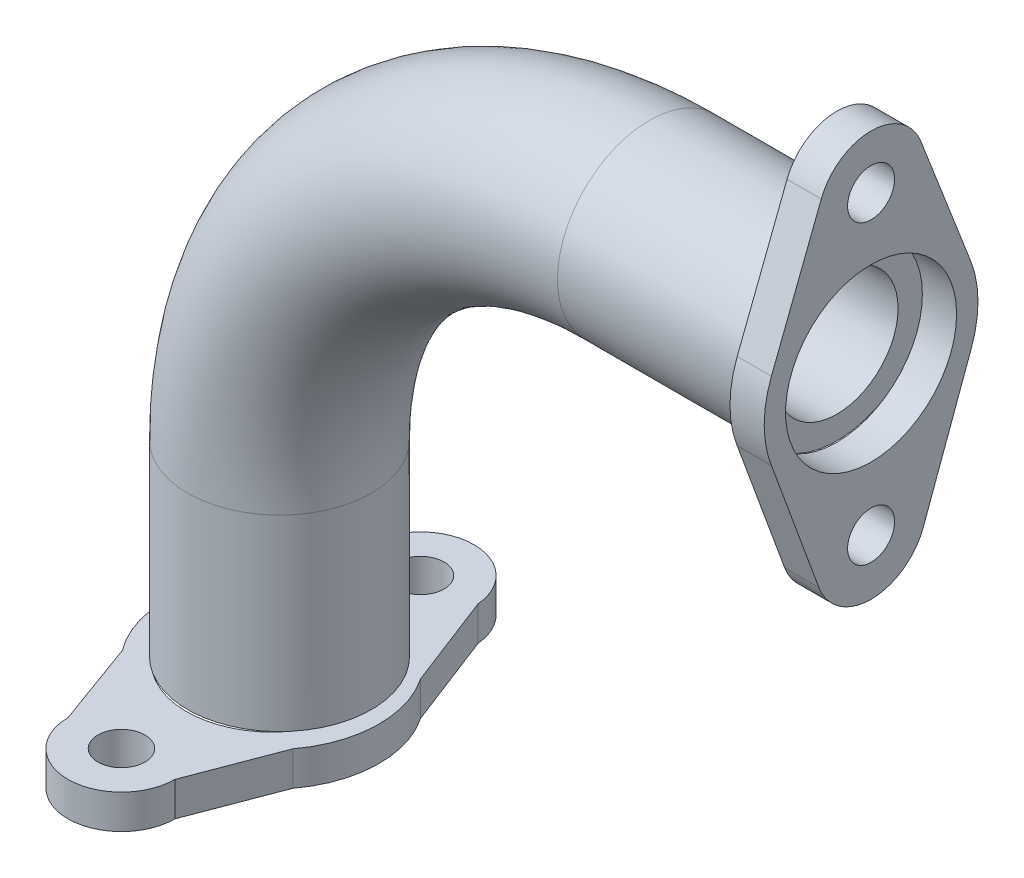
ISO-10303-21;
HEADER;
FILE_DESCRIPTION(('STEP AP214'),'2;1');
FILE_NAME('part.step','',(''),(''),'','','');
FILE_SCHEMA(('AUTOMOTIVE_DESIGN { 1 0 10303 214 1 1 1 1 }'));
ENDSEC;
DATA;
#1=APPLICATION_CONTEXT('core data for automotive mechanical design processes');
#2=APPLICATION_PROTOCOL_DEFINITION('international standard','automotive_design',2000,#1);
#3=PRODUCT_CONTEXT('',#1,'mechanical');
#4=PRODUCT('Part','Part','',(#3));
#5=PRODUCT_RELATED_PRODUCT_CATEGORY('part','',(#4));
#6=PRODUCT_DEFINITION_FORMATION('','',#4);
#7=PRODUCT_DEFINITION_CONTEXT('part definition',#1,'design');
#8=PRODUCT_DEFINITION('design','',#6,#7);
#9=PRODUCT_DEFINITION_SHAPE('','',#8);
#10=(LENGTH_UNIT() NAMED_UNIT(*) SI_UNIT(.MILLI.,.METRE.));
#11=(NAMED_UNIT(*) PLANE_ANGLE_UNIT() SI_UNIT($,.RADIAN.));
#12=(NAMED_UNIT(*) SI_UNIT($,.STERADIAN.) SOLID_ANGLE_UNIT());
#13=UNCERTAINTY_MEASURE_WITH_UNIT(LENGTH_MEASURE(1.E-05),#10,'distance_accuracy_value','');
#14=(GEOMETRIC_REPRESENTATION_CONTEXT(3) GLOBAL_UNCERTAINTY_ASSIGNED_CONTEXT((#13)) GLOBAL_UNIT_ASSIGNED_CONTEXT((#10,
#11,#12)) REPRESENTATION_CONTEXT('',''));
#15=CARTESIAN_POINT('',(0.,0.,0.));
#16=DIRECTION('',(0.,0.,1.));
#17=DIRECTION('',(1.,0.,0.));
#18=AXIS2_PLACEMENT_3D('',#15,#16,#17);
#19=CARTESIAN_POINT('',(-15.1734272968654,84.3401404687311,0.));
#20=DIRECTION('',(-1.,0.,0.));
#21=DIRECTION('',(0.,0.,1.));
#22=AXIS2_PLACEMENT_3D('',#19,#20,#21);
#23=CYLINDRICAL_SURFACE('',#22,21.5);
#24=CARTESIAN_POINT('',(-59.008690724229,84.3401404687311,0.));
#25=DIRECTION('',(-1.,0.,0.));
#26=DIRECTION('',(0.,0.,1.));
#27=AXIS2_PLACEMENT_3D('',#24,#25,#26);
#28=CIRCLE('',#27,21.5);
#29=CARTESIAN_POINT('',(-59.008690724229,105.840140468731,0.));
#30=VERTEX_POINT('',#29);
#31=EDGE_CURVE('E312',#30,#30,#28,.T.);
#32=ORIENTED_EDGE('',*,*,#31,.F.);
#33=EDGE_LOOP('',(#32));
#34=FACE_BOUND('',#33,.T.);
#35=CARTESIAN_POINT('',(-15.1734272968654,84.3401404687311,0.));
#36=DIRECTION('',(-1.,0.,0.));
#37=DIRECTION('',(0.,0.,1.));
#38=AXIS2_PLACEMENT_3D('',#35,#36,#37);
#39=CIRCLE('',#38,21.5);
#40=CARTESIAN_POINT('',(-15.1734272968654,66.0012416291643,-11.2220670712723));
#41=VERTEX_POINT('',#40);
#42=CARTESIAN_POINT('',(-15.1734272968654,66.0012416291643,11.2220670712723));
#43=VERTEX_POINT('',#42);
#44=EDGE_CURVE('E309',#41,#43,#39,.T.);
#45=ORIENTED_EDGE('',*,*,#44,.T.);
#46=EDGE_CURVE('E308',#43,#41,#39,.T.);
#47=ORIENTED_EDGE('',*,*,#46,.T.);
#48=EDGE_LOOP('',(#45,#47));
#49=FACE_BOUND('',#48,.T.);
#50=ADVANCED_FACE('F49',(#34,#49),#23,.T.);
#51=CARTESIAN_POINT('',(-59.008690724229,-2.15985953126885,0.));
#52=DIRECTION('',(0.,0.,1.));
#53=DIRECTION('',(1.,0.,0.));
#54=AXIS2_PLACEMENT_3D('',#51,#52,#53);
#55=TOROIDAL_SURFACE('',#54,86.5,21.5);
#56=CARTESIAN_POINT('',(-145.508690724229,-2.15985953126884,0.));
#57=DIRECTION('',(0.,-1.,0.));
#58=DIRECTION('',(0.,0.,1.));
#59=AXIS2_PLACEMENT_3D('',#56,#57,#58);
#60=CIRCLE('',#59,21.5);
#61=CARTESIAN_POINT('',(-167.008690724229,-2.15985953126884,0.));
#62=VERTEX_POINT('',#61);
#63=EDGE_CURVE('E187',#62,#62,#60,.T.);
#64=CARTESIAN_POINT('',(-59.008690724229,-2.15985953126885,0.));
#65=DIRECTION('',(0.,0.,1.));
#66=DIRECTION('',(1.,0.,0.));
#67=AXIS2_PLACEMENT_3D('',#64,#65,#66);
#68=CIRCLE('',#67,108.);
#69=EDGE_CURVE('',#30,#62,#68,.T.);
#70=ORIENTED_EDGE('',*,*,#31,.T.);
#71=ORIENTED_EDGE('',*,*,#63,.F.);
#72=ORIENTED_EDGE('',*,*,#69,.T.);
#73=ORIENTED_EDGE('',*,*,#69,.F.);
#74=EDGE_LOOP('',(#70,#72,#71,#73));
#75=FACE_BOUND('',#74,.T.);
#76=ADVANCED_FACE('F405',(#75),#55,.T.);
#77=CARTESIAN_POINT('',(-145.508690724229,-2.15985953126883,0.));
#78=DIRECTION('',(0.,-1.,0.));
#79=DIRECTION('',(0.,0.,-1.));
#80=AXIS2_PLACEMENT_3D('',#77,#78,#79);
#81=CYLINDRICAL_SURFACE('',#80,21.5);
#82=CARTESIAN_POINT('',(-145.508690724229,-45.9951229586325,0.));
#83=DIRECTION('',(0.,-1.,0.));
#84=DIRECTION('',(0.,0.,1.));
#85=AXIS2_PLACEMENT_3D('',#82,#83,#84);
#86=CIRCLE('',#85,21.5);
#87=CARTESIAN_POINT('',(-156.979061247246,-45.9951229586325,18.1846253759792));
#88=VERTEX_POINT('',#87);
#89=CARTESIAN_POINT('',(-129.063546314704,-45.9951229586325,13.8494485576091));
#90=VERTEX_POINT('',#89);
#91=EDGE_CURVE('E12',#88,#90,#86,.T.);
#92=ORIENTED_EDGE('',*,*,#91,.F.);
#93=EDGE_CURVE('E58',#90,#88,#86,.T.);
#94=ORIENTED_EDGE('',*,*,#93,.F.);
#95=EDGE_LOOP('',(#92,#94));
#96=FACE_BOUND('',#95,.T.);
#97=ORIENTED_EDGE('',*,*,#63,.T.);
#98=EDGE_LOOP('',(#97));
#99=FACE_BOUND('',#98,.T.);
#100=ADVANCED_FACE('F51',(#96,#99),#81,.T.);
#101=CARTESIAN_POINT('',(-7.17342729686537,117.127377221303,0.));
#102=DIRECTION('',(-1.,0.,0.));
#103=DIRECTION('',(0.,0.,1.));
#104=AXIS2_PLACEMENT_3D('',#101,#102,#103);
#105=CYLINDRICAL_SURFACE('',#104,12.5);
#106=CARTESIAN_POINT('',(-15.1734272968654,117.127377221303,0.));
#107=DIRECTION('',(1.,0.,0.));
#108=DIRECTION('',(0.,0.,-1.));
#109=AXIS2_PLACEMENT_3D('',#106,#107,#108);
#110=CIRCLE('',#109,12.5);
#111=CARTESIAN_POINT('',(-15.1734272968654,121.647035289315,-11.6542992474131));
#112=VERTEX_POINT('',#111);
#113=CARTESIAN_POINT('',(-15.1734272968654,121.647035289315,11.6542992474131));
#114=VERTEX_POINT('',#113);
#115=EDGE_CURVE('E250',#112,#114,#110,.T.);
#116=ORIENTED_EDGE('',*,*,#115,.T.);
#117=DIRECTION('',(-1.,0.,0.));
#118=VECTOR('',#117,1.);
#119=CARTESIAN_POINT('',(-7.17342729686537,121.647035289315,11.6542992474131));
#120=LINE('',#119,#118);
#121=CARTESIAN_POINT('',(-7.17342729686537,121.647035289315,11.6542992474131));
#122=VERTEX_POINT('',#121);
#123=EDGE_CURVE('E305',#122,#114,#120,.T.);
#124=ORIENTED_EDGE('',*,*,#123,.F.);
#125=CARTESIAN_POINT('',(-7.17342729686537,117.127377221303,0.));
#126=DIRECTION('',(1.,0.,0.));
#127=DIRECTION('',(0.,0.,-1.));
#128=AXIS2_PLACEMENT_3D('',#125,#126,#127);
#129=CIRCLE('',#128,12.5);
#130=CARTESIAN_POINT('',(-7.17342729686537,121.647035289315,-11.6542992474131));
#131=VERTEX_POINT('',#130);
#132=EDGE_CURVE('E251',#131,#122,#129,.T.);
#133=ORIENTED_EDGE('',*,*,#132,.F.);
#134=DIRECTION('',(-1.,0.,0.));
#135=VECTOR('',#134,1.);
#136=CARTESIAN_POINT('',(-7.17342729686537,121.647035289315,-11.6542992474131));
#137=LINE('',#136,#135);
#138=EDGE_CURVE('E269',#131,#112,#137,.T.);
#139=ORIENTED_EDGE('',*,*,#138,.T.);
#140=EDGE_LOOP('',(#116,#124,#133,#139));
#141=FACE_BOUND('',#140,.T.);
#142=ADVANCED_FACE('F404',(#141),#105,.T.);
#143=CARTESIAN_POINT('',(-7.17342729686537,121.647035289315,11.6542992474131));
#144=DIRECTION('',(0.,-0.361572645440974,-0.932343939793044));
#145=DIRECTION('',(0.,0.932343939793044,-0.361572645440974));
#146=AXIS2_PLACEMENT_3D('',#143,#144,#145);
#147=PLANE('',#146);
#148=DIRECTION('',(0.,-0.932343939793044,0.361572645440974));
#149=VECTOR('',#148,1.);
#150=CARTESIAN_POINT('',(-15.1734272968654,121.647035289315,11.6542992474131));
#151=LINE('',#150,#149);
#152=CARTESIAN_POINT('',(-15.1734272968654,91.5954699859597,23.3086078159745));
#153=VERTEX_POINT('',#152);
#154=EDGE_CURVE('E272',#114,#153,#151,.T.);
#155=ORIENTED_EDGE('',*,*,#154,.T.);
#156=DIRECTION('',(-1.,0.,0.));
#157=VECTOR('',#156,1.);
#158=CARTESIAN_POINT('',(-7.17342729686537,91.5954699859597,23.3086078159745));
#159=LINE('',#158,#157);
#160=CARTESIAN_POINT('',(-7.17342729686537,91.5954699859597,23.3086078159745));
#161=VERTEX_POINT('',#160);
#162=EDGE_CURVE('E302',#161,#153,#159,.T.);
#163=ORIENTED_EDGE('',*,*,#162,.F.);
#164=DIRECTION('',(0.,-0.932343939793044,0.361572645440974));
#165=VECTOR('',#164,1.);
#166=CARTESIAN_POINT('',(-7.17342729686537,121.647035289315,11.6542992474131));
#167=LINE('',#166,#165);
#168=EDGE_CURVE('E254',#122,#161,#167,.T.);
#169=ORIENTED_EDGE('',*,*,#168,.F.);
#170=ORIENTED_EDGE('',*,*,#123,.T.);
#171=EDGE_LOOP('',(#155,#163,#169,#170));
#172=FACE_BOUND('',#171,.T.);
#173=ADVANCED_FACE('F410',(#172),#147,.F.);
#174=CARTESIAN_POINT('',(-7.17342729686537,82.5561566288817,0.));
#175=DIRECTION('',(-1.,0.,0.));
#176=DIRECTION('',(0.,0.,1.));
#177=AXIS2_PLACEMENT_3D('',#174,#175,#176);
#178=CYLINDRICAL_SURFACE('',#177,25.0000076857259);
#179=CARTESIAN_POINT('',(-15.1734272968654,82.5561566288817,0.));
#180=DIRECTION('',(1.,0.,0.));
#181=DIRECTION('',(0.,0.,-1.));
#182=AXIS2_PLACEMENT_3D('',#179,#180,#181);
#183=CIRCLE('',#182,25.0000076857259);
#184=CARTESIAN_POINT('',(-15.1734272968654,73.5168432718036,23.3086078159745));
#185=VERTEX_POINT('',#184);
#186=EDGE_CURVE('E274',#153,#185,#183,.T.);
#187=ORIENTED_EDGE('',*,*,#186,.T.);
#188=DIRECTION('',(-1.,0.,0.));
#189=VECTOR('',#188,1.);
#190=CARTESIAN_POINT('',(-7.17342729686537,73.5168432718036,23.3086078159745));
#191=LINE('',#190,#189);
#192=CARTESIAN_POINT('',(-7.17342729686537,73.5168432718036,23.3086078159745));
#193=VERTEX_POINT('',#192);
#194=EDGE_CURVE('E299',#193,#185,#191,.T.);
#195=ORIENTED_EDGE('',*,*,#194,.F.);
#196=CARTESIAN_POINT('',(-7.17342729686537,82.5561566288817,0.));
#197=DIRECTION('',(1.,0.,0.));
#198=DIRECTION('',(0.,0.,-1.));
#199=AXIS2_PLACEMENT_3D('',#196,#197,#198);
#200=CIRCLE('',#199,25.0000076857259);
#201=EDGE_CURVE('E257',#161,#193,#200,.T.);
#202=ORIENTED_EDGE('',*,*,#201,.F.);
#203=ORIENTED_EDGE('',*,*,#162,.T.);
#204=EDGE_LOOP('',(#187,#195,#202,#203));
#205=FACE_BOUND('',#204,.T.);
#206=ADVANCED_FACE('F424',(#205),#178,.T.);
#207=CARTESIAN_POINT('',(-7.17342729686537,73.5168432718036,23.3086078159745));
#208=DIRECTION('',(0.,0.344407754684744,-0.938820163030712));
#209=DIRECTION('',(0.,0.938820163030712,0.344407754684744));
#210=AXIS2_PLACEMENT_3D('',#207,#208,#209);
#211=PLANE('',#210);
#212=DIRECTION('',(0.,-0.938820163030712,-0.344407754684744));
#213=VECTOR('',#212,1.);
#214=CARTESIAN_POINT('',(-15.1734272968654,73.5168432718036,23.3086078159745));
#215=LINE('',#214,#213);
#216=CARTESIAN_POINT('',(-15.1734272968654,43.2393386599172,12.2012543616414));
#217=VERTEX_POINT('',#216);
#218=EDGE_CURVE('E276',#185,#217,#215,.T.);
#219=ORIENTED_EDGE('',*,*,#218,.T.);
#220=DIRECTION('',(-1.,0.,0.));
#221=VECTOR('',#220,1.);
#222=CARTESIAN_POINT('',(-7.17342729686537,43.2393386599172,12.2012543616414));
#223=LINE('',#222,#221);
#224=CARTESIAN_POINT('',(-7.17342729686537,43.2393386599172,12.2012543616414));
#225=VERTEX_POINT('',#224);
#226=EDGE_CURVE('E296',#225,#217,#223,.T.);
#227=ORIENTED_EDGE('',*,*,#226,.F.);
#228=DIRECTION('',(0.,-0.938820163030712,-0.344407754684744));
#229=VECTOR('',#228,1.);
#230=CARTESIAN_POINT('',(-7.17342729686537,73.5168432718036,23.3086078159745));
#231=LINE('',#230,#229);
#232=EDGE_CURVE('E259',#193,#225,#231,.T.);
#233=ORIENTED_EDGE('',*,*,#232,.F.);
#234=ORIENTED_EDGE('',*,*,#194,.T.);
#235=EDGE_LOOP('',(#219,#227,#233,#234));
#236=FACE_BOUND('',#235,.T.);
#237=ADVANCED_FACE('F428',(#236),#211,.F.);
#238=CARTESIAN_POINT('',(-7.17342729686537,47.7643186976326,0.));
#239=DIRECTION('',(-1.,0.,0.));
#240=DIRECTION('',(0.,0.,1.));
#241=AXIS2_PLACEMENT_3D('',#238,#239,#240);
#242=CYLINDRICAL_SURFACE('',#241,13.013302898926);
#243=CARTESIAN_POINT('',(-15.1734272968654,47.7643186976326,0.));
#244=DIRECTION('',(1.,0.,0.));
#245=DIRECTION('',(0.,0.,-1.));
#246=AXIS2_PLACEMENT_3D('',#243,#244,#245);
#247=CIRCLE('',#246,13.013302898926);
#248=CARTESIAN_POINT('',(-15.1734272968654,43.2393386599172,-12.2012543616414));
#249=VERTEX_POINT('',#248);
#250=EDGE_CURVE('E278',#217,#249,#247,.T.);
#251=ORIENTED_EDGE('',*,*,#250,.T.);
#252=DIRECTION('',(-1.,0.,0.));
#253=VECTOR('',#252,1.);
#254=CARTESIAN_POINT('',(-7.17342729686537,43.2393386599172,-12.2012543616414));
#255=LINE('',#254,#253);
#256=CARTESIAN_POINT('',(-7.17342729686537,43.2393386599172,-12.2012543616414));
#257=VERTEX_POINT('',#256);
#258=EDGE_CURVE('E293',#257,#249,#255,.T.);
#259=ORIENTED_EDGE('',*,*,#258,.F.);
#260=CARTESIAN_POINT('',(-7.17342729686537,47.7643186976326,0.));
#261=DIRECTION('',(1.,0.,0.));
#262=DIRECTION('',(0.,0.,-1.));
#263=AXIS2_PLACEMENT_3D('',#260,#261,#262);
#264=CIRCLE('',#263,13.013302898926);
#265=EDGE_CURVE('E261',#225,#257,#264,.T.);
#266=ORIENTED_EDGE('',*,*,#265,.F.);
#267=ORIENTED_EDGE('',*,*,#226,.T.);
#268=EDGE_LOOP('',(#251,#259,#266,#267));
#269=FACE_BOUND('',#268,.T.);
#270=ADVANCED_FACE('F432',(#269),#242,.T.);
#271=CARTESIAN_POINT('',(-7.17342729686537,73.5168432718036,-23.3086078159745));
#272=DIRECTION('',(0.,0.344407754684744,0.938820163030713));
#273=DIRECTION('',(0.,-0.938820163030713,0.344407754684744));
#274=AXIS2_PLACEMENT_3D('',#271,#272,#273);
#275=PLANE('',#274);
#276=DIRECTION('',(0.,0.938820163030713,-0.344407754684744));
#277=VECTOR('',#276,1.);
#278=CARTESIAN_POINT('',(-15.1734272968654,73.5168432718036,-23.3086078159745));
#279=LINE('',#278,#277);
#280=CARTESIAN_POINT('',(-15.1734272968654,73.5168432718036,-23.3086078159745));
#281=VERTEX_POINT('',#280);
#282=EDGE_CURVE('E280',#249,#281,#279,.T.);
#283=ORIENTED_EDGE('',*,*,#282,.T.);
#284=DIRECTION('',(-1.,0.,0.));
#285=VECTOR('',#284,1.);
#286=CARTESIAN_POINT('',(-7.17342729686537,73.5168432718036,-23.3086078159745));
#287=LINE('',#286,#285);
#288=CARTESIAN_POINT('',(-7.17342729686537,73.5168432718036,-23.3086078159745));
#289=VERTEX_POINT('',#288);
#290=EDGE_CURVE('E290',#289,#281,#287,.T.);
#291=ORIENTED_EDGE('',*,*,#290,.F.);
#292=DIRECTION('',(0.,0.938820163030713,-0.344407754684744));
#293=VECTOR('',#292,1.);
#294=CARTESIAN_POINT('',(-7.17342729686537,73.5168432718036,-23.3086078159745));
#295=LINE('',#294,#293);
#296=EDGE_CURVE('E263',#257,#289,#295,.T.);
#297=ORIENTED_EDGE('',*,*,#296,.F.);
#298=ORIENTED_EDGE('',*,*,#258,.T.);
#299=EDGE_LOOP('',(#283,#291,#297,#298));
#300=FACE_BOUND('',#299,.T.);
#301=ADVANCED_FACE('F436',(#300),#275,.F.);
#302=CARTESIAN_POINT('',(-7.17342729686537,82.5561566288817,0.));
#303=DIRECTION('',(-1.,0.,0.));
#304=DIRECTION('',(0.,0.,1.));
#305=AXIS2_PLACEMENT_3D('',#302,#303,#304);
#306=CYLINDRICAL_SURFACE('',#305,25.0000076857259);
#307=CARTESIAN_POINT('',(-15.1734272968654,82.5561566288817,0.));
#308=DIRECTION('',(1.,0.,0.));
#309=DIRECTION('',(0.,0.,-1.));
#310=AXIS2_PLACEMENT_3D('',#307,#308,#309);
#311=CIRCLE('',#310,25.0000076857259);
#312=CARTESIAN_POINT('',(-15.1734272968654,91.5954699859597,-23.3086078159745));
#313=VERTEX_POINT('',#312);
#314=EDGE_CURVE('E282',#281,#313,#311,.T.);
#315=ORIENTED_EDGE('',*,*,#314,.T.);
#316=DIRECTION('',(-1.,0.,0.));
#317=VECTOR('',#316,1.);
#318=CARTESIAN_POINT('',(-7.17342729686537,91.5954699859597,-23.3086078159745));
#319=LINE('',#318,#317);
#320=CARTESIAN_POINT('',(-7.17342729686537,91.5954699859597,-23.3086078159745));
#321=VERTEX_POINT('',#320);
#322=EDGE_CURVE('E287',#321,#313,#319,.T.);
#323=ORIENTED_EDGE('',*,*,#322,.F.);
#324=CARTESIAN_POINT('',(-7.17342729686537,82.5561566288817,0.));
#325=DIRECTION('',(1.,0.,0.));
#326=DIRECTION('',(0.,0.,-1.));
#327=AXIS2_PLACEMENT_3D('',#324,#325,#326);
#328=CIRCLE('',#327,25.0000076857259);
#329=EDGE_CURVE('E265',#289,#321,#328,.T.);
#330=ORIENTED_EDGE('',*,*,#329,.F.);
#331=ORIENTED_EDGE('',*,*,#290,.T.);
#332=EDGE_LOOP('',(#315,#323,#330,#331));
#333=FACE_BOUND('',#332,.T.);
#334=ADVANCED_FACE('F440',(#333),#306,.T.);
#335=CARTESIAN_POINT('',(-7.17342729686537,121.647035289315,-11.6542992474131));
#336=DIRECTION('',(0.,-0.361572645440974,0.932343939793044));
#337=DIRECTION('',(0.,-0.932343939793044,-0.361572645440974));
#338=AXIS2_PLACEMENT_3D('',#335,#336,#337);
#339=PLANE('',#338);
#340=DIRECTION('',(0.,0.932343939793044,0.361572645440974));
#341=VECTOR('',#340,1.);
#342=CARTESIAN_POINT('',(-15.1734272968654,121.647035289315,-11.6542992474131));
#343=LINE('',#342,#341);
#344=EDGE_CURVE('E255',#313,#112,#343,.T.);
#345=ORIENTED_EDGE('',*,*,#344,.T.);
#346=ORIENTED_EDGE('',*,*,#138,.F.);
#347=DIRECTION('',(0.,0.932343939793044,0.361572645440974));
#348=VECTOR('',#347,1.);
#349=CARTESIAN_POINT('',(-7.17342729686537,121.647035289315,-11.6542992474131));
#350=LINE('',#349,#348);
#351=EDGE_CURVE('E267',#321,#131,#350,.T.);
#352=ORIENTED_EDGE('',*,*,#351,.F.);
#353=ORIENTED_EDGE('',*,*,#322,.T.);
#354=EDGE_LOOP('',(#345,#346,#352,#353));
#355=FACE_BOUND('',#354,.T.);
#356=ADVANCED_FACE('F444',(#355),#339,.F.);
#357=CARTESIAN_POINT('',(-7.17342729686537,117.127377221303,0.));
#358=DIRECTION('',(1.,0.,0.));
#359=DIRECTION('',(0.,0.,-1.));
#360=AXIS2_PLACEMENT_3D('',#357,#358,#359);
#361=PLANE('',#360);
#362=CARTESIAN_POINT('',(-7.17342729686537,117.127377221303,0.));
#363=DIRECTION('',(1.,0.,0.));
#364=DIRECTION('',(0.,0.,-1.));
#365=AXIS2_PLACEMENT_3D('',#362,#363,#364);
#366=CIRCLE('',#365,5.5);
#367=CARTESIAN_POINT('',(-7.17342729686537,117.127377221303,-5.5));
#368=VERTEX_POINT('',#367);
#369=EDGE_CURVE('E318',#368,#368,#366,.T.);
#370=ORIENTED_EDGE('',*,*,#369,.F.);
#371=EDGE_LOOP('',(#370));
#372=FACE_BOUND('',#371,.T.);
#373=CARTESIAN_POINT('',(-7.17342729686537,47.7643186976326,0.));
#374=DIRECTION('',(1.,0.,0.));
#375=DIRECTION('',(0.,0.,-1.));
#376=AXIS2_PLACEMENT_3D('',#373,#374,#375);
#377=CIRCLE('',#376,5.5);
#378=CARTESIAN_POINT('',(-7.17342729686537,47.7643186976326,-5.50000000000001));
#379=VERTEX_POINT('',#378);
#380=EDGE_CURVE('E324',#379,#379,#377,.T.);
#381=ORIENTED_EDGE('',*,*,#380,.F.);
#382=EDGE_LOOP('',(#381));
#383=FACE_BOUND('',#382,.T.);
#384=CARTESIAN_POINT('',(-7.17342729686537,82.5561566288817,0.));
#385=DIRECTION('',(1.,0.,0.));
#386=DIRECTION('',(0.,0.,-1.));
#387=AXIS2_PLACEMENT_3D('',#384,#385,#386);
#388=CIRCLE('',#387,20.);
#389=CARTESIAN_POINT('',(-7.17342729686537,82.5561566288817,-20.));
#390=VERTEX_POINT('',#389);
#391=EDGE_CURVE('E184',#390,#390,#388,.T.);
#392=ORIENTED_EDGE('',*,*,#391,.F.);
#393=EDGE_LOOP('',(#392));
#394=FACE_BOUND('',#393,.T.);
#395=ORIENTED_EDGE('',*,*,#132,.T.);
#396=ORIENTED_EDGE('',*,*,#168,.T.);
#397=ORIENTED_EDGE('',*,*,#201,.T.);
#398=ORIENTED_EDGE('',*,*,#232,.T.);
#399=ORIENTED_EDGE('',*,*,#265,.T.);
#400=ORIENTED_EDGE('',*,*,#296,.T.);
#401=ORIENTED_EDGE('',*,*,#329,.T.);
#402=ORIENTED_EDGE('',*,*,#351,.T.);
#403=EDGE_LOOP('',(#395,#396,#397,#398,#399,#400,#401,#402));
#404=FACE_BOUND('',#403,.T.);
#405=ADVANCED_FACE('F448',(#372,#383,#394,#404),#361,.T.);
#406=CARTESIAN_POINT('',(-15.1734272968654,117.127377221303,0.));
#407=DIRECTION('',(1.,0.,0.));
#408=DIRECTION('',(0.,0.,-1.));
#409=AXIS2_PLACEMENT_3D('',#406,#407,#408);
#410=PLANE('',#409);
#411=CARTESIAN_POINT('',(-15.1734272968654,117.127377221303,0.));
#412=DIRECTION('',(1.,0.,0.));
#413=DIRECTION('',(0.,0.,-1.));
#414=AXIS2_PLACEMENT_3D('',#411,#412,#413);
#415=CIRCLE('',#414,5.5);
#416=CARTESIAN_POINT('',(-15.1734272968654,117.127377221303,-5.5));
#417=VERTEX_POINT('',#416);
#418=EDGE_CURVE('E53',#417,#417,#415,.T.);
#419=ORIENTED_EDGE('',*,*,#418,.T.);
#420=EDGE_LOOP('',(#419));
#421=FACE_BOUND('',#420,.T.);
#422=CARTESIAN_POINT('',(-15.1734272968654,47.7643186976326,0.));
#423=DIRECTION('',(1.,0.,0.));
#424=DIRECTION('',(0.,0.,-1.));
#425=AXIS2_PLACEMENT_3D('',#422,#423,#424);
#426=CIRCLE('',#425,5.5);
#427=CARTESIAN_POINT('',(-15.1734272968654,47.7643186976326,-5.50000000000001));
#428=VERTEX_POINT('',#427);
#429=EDGE_CURVE('E316',#428,#428,#426,.T.);
#430=ORIENTED_EDGE('',*,*,#429,.T.);
#431=EDGE_LOOP('',(#430));
#432=FACE_BOUND('',#431,.T.);
#433=ORIENTED_EDGE('',*,*,#46,.F.);
#434=CARTESIAN_POINT('',(-15.1734272968654,82.5561566288817,0.));
#435=DIRECTION('',(1.,0.,0.));
#436=DIRECTION('',(0.,0.,-1.));
#437=AXIS2_PLACEMENT_3D('',#434,#435,#436);
#438=CIRCLE('',#437,20.);
#439=EDGE_CURVE('E207',#43,#41,#438,.T.);
#440=ORIENTED_EDGE('',*,*,#439,.T.);
#441=EDGE_LOOP('',(#433,#440));
#442=FACE_BOUND('',#441,.T.);
#443=ORIENTED_EDGE('',*,*,#115,.F.);
#444=ORIENTED_EDGE('',*,*,#344,.F.);
#445=ORIENTED_EDGE('',*,*,#314,.F.);
#446=ORIENTED_EDGE('',*,*,#282,.F.);
#447=ORIENTED_EDGE('',*,*,#250,.F.);
#448=ORIENTED_EDGE('',*,*,#218,.F.);
#449=ORIENTED_EDGE('',*,*,#186,.F.);
#450=ORIENTED_EDGE('',*,*,#154,.F.);
#451=EDGE_LOOP('',(#443,#444,#445,#446,#447,#448,#449,#450));
#452=FACE_BOUND('',#451,.T.);
#453=ADVANCED_FACE('F450',(#421,#432,#442,#452),#410,.F.);
#454=CARTESIAN_POINT('',(-145.194128548207,-53.9951229586325,2.02556100705259));
#455=DIRECTION('',(0.,1.,0.));
#456=DIRECTION('',(0.,0.,1.));
#457=AXIS2_PLACEMENT_3D('',#454,#455,#456);
#458=CYLINDRICAL_SURFACE('',#457,25.);
#459=CARTESIAN_POINT('',(-145.194128548207,-45.9951229586325,2.02556100705259));
#460=DIRECTION('',(0.,-1.,0.));
#461=DIRECTION('',(0.,0.,-1.));
#462=AXIS2_PLACEMENT_3D('',#459,#460,#461);
#463=CIRCLE('',#462,25.);
#464=CARTESIAN_POINT('',(-124.515630896963,-45.9951229586325,-12.0243405900226));
#465=VERTEX_POINT('',#464);
#466=CARTESIAN_POINT('',(-125.252486994008,-45.9951229586325,17.1030585488813));
#467=VERTEX_POINT('',#466);
#468=EDGE_CURVE('E198',#465,#467,#463,.T.);
#469=ORIENTED_EDGE('',*,*,#468,.T.);
#470=DIRECTION('',(0.,1.,0.));
#471=VECTOR('',#470,1.);
#472=CARTESIAN_POINT('',(-125.252486994008,-53.9951229586325,17.1030585488813));
#473=LINE('',#472,#471);
#474=CARTESIAN_POINT('',(-125.252486994008,-53.9951229586325,17.1030585488813));
#475=VERTEX_POINT('',#474);
#476=EDGE_CURVE('E248',#475,#467,#473,.T.);
#477=ORIENTED_EDGE('',*,*,#476,.F.);
#478=CARTESIAN_POINT('',(-145.194128548207,-53.9951229586325,2.02556100705259));
#479=DIRECTION('',(0.,-1.,0.));
#480=DIRECTION('',(0.,0.,-1.));
#481=AXIS2_PLACEMENT_3D('',#478,#479,#480);
#482=CIRCLE('',#481,25.);
#483=CARTESIAN_POINT('',(-124.515630896963,-53.9951229586325,-12.0243405900226));
#484=VERTEX_POINT('',#483);
#485=EDGE_CURVE('E227',#484,#475,#482,.T.);
#486=ORIENTED_EDGE('',*,*,#485,.F.);
#487=DIRECTION('',(0.,1.,0.));
#488=VECTOR('',#487,1.);
#489=CARTESIAN_POINT('',(-124.515630896963,-53.9951229586325,-12.0243405900226));
#490=LINE('',#489,#488);
#491=EDGE_CURVE('E228',#484,#465,#490,.T.);
#492=ORIENTED_EDGE('',*,*,#491,.T.);
#493=EDGE_LOOP('',(#469,#477,#486,#492));
#494=FACE_BOUND('',#493,.T.);
#495=ADVANCED_FACE('F370',(#494),#458,.T.);
#496=CARTESIAN_POINT('',(-132.861790455697,-53.9951229586325,37.1030585488813));
#497=DIRECTION('',(-0.934639137598938,0.,-0.355597641258085));
#498=DIRECTION('',(-0.355597641258085,0.,0.934639137598938));
#499=AXIS2_PLACEMENT_3D('',#496,#497,#498);
#500=PLANE('',#499);
#501=DIRECTION('',(-0.355597641258085,0.,0.934639137598938));
#502=VECTOR('',#501,1.);
#503=CARTESIAN_POINT('',(-132.861790455697,-45.9951229586325,37.1030585488813));
#504=LINE('',#503,#502);
#505=CARTESIAN_POINT('',(-132.861790455697,-45.9951229586325,37.1030585488813));
#506=VERTEX_POINT('',#505);
#507=EDGE_CURVE('E202',#467,#506,#504,.T.);
#508=ORIENTED_EDGE('',*,*,#507,.T.);
#509=DIRECTION('',(0.,1.,0.));
#510=VECTOR('',#509,1.);
#511=CARTESIAN_POINT('',(-132.861790455697,-53.9951229586325,37.1030585488813));
#512=LINE('',#511,#510);
#513=CARTESIAN_POINT('',(-132.861790455697,-53.9951229586325,37.1030585488813));
#514=VERTEX_POINT('',#513);
#515=EDGE_CURVE('E245',#514,#506,#512,.T.);
#516=ORIENTED_EDGE('',*,*,#515,.F.);
#517=DIRECTION('',(-0.355597641258085,0.,0.934639137598938));
#518=VECTOR('',#517,1.);
#519=CARTESIAN_POINT('',(-132.861790455697,-53.9951229586325,37.1030585488813));
#520=LINE('',#519,#518);
#521=EDGE_CURVE('E352',#475,#514,#520,.T.);
#522=ORIENTED_EDGE('',*,*,#521,.F.);
#523=ORIENTED_EDGE('',*,*,#476,.T.);
#524=EDGE_LOOP('',(#508,#516,#522,#523));
#525=FACE_BOUND('',#524,.T.);
#526=ADVANCED_FACE('F372',(#525),#500,.F.);
#527=CARTESIAN_POINT('',(-145.361790455697,-53.9951229586325,37.1030585488814));
#528=DIRECTION('',(0.,1.,0.));
#529=DIRECTION('',(0.,0.,1.));
#530=AXIS2_PLACEMENT_3D('',#527,#528,#529);
#531=CYLINDRICAL_SURFACE('',#530,12.5);
#532=CARTESIAN_POINT('',(-145.361790455697,-45.9951229586325,37.1030585488814));
#533=DIRECTION('',(0.,-1.,0.));
#534=DIRECTION('',(0.,0.,-1.));
#535=AXIS2_PLACEMENT_3D('',#532,#533,#534);
#536=CIRCLE('',#535,12.5);
#537=CARTESIAN_POINT('',(-157.861790455697,-45.9951229586325,37.1030585488813));
#538=VERTEX_POINT('',#537);
#539=EDGE_CURVE('E209',#506,#538,#536,.T.);
#540=ORIENTED_EDGE('',*,*,#539,.T.);
#541=DIRECTION('',(0.,1.,0.));
#542=VECTOR('',#541,1.);
#543=CARTESIAN_POINT('',(-157.861790455697,-53.9951229586325,37.1030585488813));
#544=LINE('',#543,#542);
#545=CARTESIAN_POINT('',(-157.861790455697,-53.9951229586325,37.1030585488813));
#546=VERTEX_POINT('',#545);
#547=EDGE_CURVE('E242',#546,#538,#544,.T.);
#548=ORIENTED_EDGE('',*,*,#547,.F.);
#549=CARTESIAN_POINT('',(-145.361790455697,-53.9951229586325,37.1030585488814));
#550=DIRECTION('',(0.,-1.,0.));
#551=DIRECTION('',(0.,0.,-1.));
#552=AXIS2_PLACEMENT_3D('',#549,#550,#551);
#553=CIRCLE('',#552,12.5);
#554=EDGE_CURVE('E354',#514,#546,#553,.T.);
#555=ORIENTED_EDGE('',*,*,#554,.F.);
#556=ORIENTED_EDGE('',*,*,#515,.T.);
#557=EDGE_LOOP('',(#540,#548,#555,#556));
#558=FACE_BOUND('',#557,.T.);
#559=ADVANCED_FACE('F379',(#558),#531,.T.);
#560=CARTESIAN_POINT('',(-157.861790455697,-53.9951229586325,37.1030585488813));
#561=DIRECTION('',(0.939774522137706,0.,-0.341795037326241));
#562=DIRECTION('',(-0.341795037326241,0.,-0.939774522137706));
#563=AXIS2_PLACEMENT_3D('',#560,#561,#562);
#564=PLANE('',#563);
#565=DIRECTION('',(-0.341795037326241,0.,-0.939774522137706));
#566=VECTOR('',#565,1.);
#567=CARTESIAN_POINT('',(-157.861790455697,-45.9951229586325,37.1030585488813));
#568=LINE('',#567,#566);
#569=CARTESIAN_POINT('',(-165.135770102405,-45.9951229586325,17.1030585488814));
#570=VERTEX_POINT('',#569);
#571=EDGE_CURVE('E218',#538,#570,#568,.T.);
#572=ORIENTED_EDGE('',*,*,#571,.T.);
#573=DIRECTION('',(0.,1.,0.));
#574=VECTOR('',#573,1.);
#575=CARTESIAN_POINT('',(-165.135770102405,-53.9951229586325,17.1030585488814));
#576=LINE('',#575,#574);
#577=CARTESIAN_POINT('',(-165.135770102405,-53.9951229586325,17.1030585488814));
#578=VERTEX_POINT('',#577);
#579=EDGE_CURVE('E239',#578,#570,#576,.T.);
#580=ORIENTED_EDGE('',*,*,#579,.F.);
#581=DIRECTION('',(-0.341795037326241,0.,-0.939774522137706));
#582=VECTOR('',#581,1.);
#583=CARTESIAN_POINT('',(-157.861790455697,-53.9951229586325,37.1030585488813));
#584=LINE('',#583,#582);
#585=EDGE_CURVE('E356',#546,#578,#584,.T.);
#586=ORIENTED_EDGE('',*,*,#585,.F.);
#587=ORIENTED_EDGE('',*,*,#547,.T.);
#588=EDGE_LOOP('',(#572,#580,#586,#587));
#589=FACE_BOUND('',#588,.T.);
#590=ADVANCED_FACE('F382',(#589),#564,.F.);
#591=CARTESIAN_POINT('',(-145.194128548207,-53.9951229586325,2.02556100705259));
#592=DIRECTION('',(0.,1.,0.));
#593=DIRECTION('',(0.,0.,1.));
#594=AXIS2_PLACEMENT_3D('',#591,#592,#593);
#595=CYLINDRICAL_SURFACE('',#594,25.);
#596=CARTESIAN_POINT('',(-145.194128548207,-45.9951229586325,2.02556100705259));
#597=DIRECTION('',(0.,-1.,0.));
#598=DIRECTION('',(0.,0.,-1.));
#599=AXIS2_PLACEMENT_3D('',#596,#597,#598);
#600=CIRCLE('',#599,25.);
#601=CARTESIAN_POINT('',(-164.347898170566,-45.9951229586325,-14.0409603729348));
#602=VERTEX_POINT('',#601);
#603=EDGE_CURVE('E220',#570,#602,#600,.T.);
#604=ORIENTED_EDGE('',*,*,#603,.T.);
#605=DIRECTION('',(0.,1.,0.));
#606=VECTOR('',#605,1.);
#607=CARTESIAN_POINT('',(-164.347898170566,-53.9951229586325,-14.0409603729348));
#608=LINE('',#607,#606);
#609=CARTESIAN_POINT('',(-164.347898170566,-53.9951229586325,-14.0409603729348));
#610=VERTEX_POINT('',#609);
#611=EDGE_CURVE('E236',#610,#602,#608,.T.);
#612=ORIENTED_EDGE('',*,*,#611,.F.);
#613=CARTESIAN_POINT('',(-145.194128548207,-53.9951229586325,2.02556100705259));
#614=DIRECTION('',(0.,-1.,0.));
#615=DIRECTION('',(0.,0.,-1.));
#616=AXIS2_PLACEMENT_3D('',#613,#614,#615);
#617=CIRCLE('',#616,25.);
#618=EDGE_CURVE('E358',#578,#610,#617,.T.);
#619=ORIENTED_EDGE('',*,*,#618,.F.);
#620=ORIENTED_EDGE('',*,*,#579,.T.);
#621=EDGE_LOOP('',(#604,#612,#619,#620));
#622=FACE_BOUND('',#621,.T.);
#623=ADVANCED_FACE('F387',(#622),#595,.T.);
#624=CARTESIAN_POINT('',(-157.880174746904,-53.9951229586325,-34.0409603729348));
#625=DIRECTION('',(0.951484426688411,0.,0.307696905687116));
#626=DIRECTION('',(0.307696905687116,0.,-0.951484426688411));
#627=AXIS2_PLACEMENT_3D('',#624,#625,#626);
#628=PLANE('',#627);
#629=DIRECTION('',(0.307696905687116,0.,-0.951484426688411));
#630=VECTOR('',#629,1.);
#631=CARTESIAN_POINT('',(-157.880174746904,-45.9951229586325,-34.0409603729348));
#632=LINE('',#631,#630);
#633=CARTESIAN_POINT('',(-157.880174746904,-45.9951229586325,-34.0409603729348));
#634=VERTEX_POINT('',#633);
#635=EDGE_CURVE('E222',#602,#634,#632,.T.);
#636=ORIENTED_EDGE('',*,*,#635,.T.);
#637=DIRECTION('',(0.,1.,0.));
#638=VECTOR('',#637,1.);
#639=CARTESIAN_POINT('',(-157.880174746904,-53.9951229586325,-34.0409603729348));
#640=LINE('',#639,#638);
#641=CARTESIAN_POINT('',(-157.880174746904,-53.9951229586325,-34.0409603729348));
#642=VERTEX_POINT('',#641);
#643=EDGE_CURVE('E233',#642,#634,#640,.T.);
#644=ORIENTED_EDGE('',*,*,#643,.F.);
#645=DIRECTION('',(0.307696905687116,0.,-0.951484426688411));
#646=VECTOR('',#645,1.);
#647=CARTESIAN_POINT('',(-157.880174746904,-53.9951229586325,-34.0409603729348));
#648=LINE('',#647,#646);
#649=EDGE_CURVE('E360',#610,#642,#648,.T.);
#650=ORIENTED_EDGE('',*,*,#649,.F.);
#651=ORIENTED_EDGE('',*,*,#611,.T.);
#652=EDGE_LOOP('',(#636,#644,#650,#651));
#653=FACE_BOUND('',#652,.T.);
#654=ADVANCED_FACE('F391',(#653),#628,.F.);
#655=CARTESIAN_POINT('',(-145.432617565443,-53.9951229586325,-32.8971421119082));
#656=DIRECTION('',(0.,1.,0.));
#657=DIRECTION('',(0.,0.,1.));
#658=AXIS2_PLACEMENT_3D('',#655,#656,#657);
#659=CYLINDRICAL_SURFACE('',#658,12.5);
#660=CARTESIAN_POINT('',(-145.432617565443,-45.9951229586325,-32.8971421119082));
#661=DIRECTION('',(0.,-1.,0.));
#662=DIRECTION('',(0.,0.,-1.));
#663=AXIS2_PLACEMENT_3D('',#660,#661,#662);
#664=CIRCLE('',#663,12.5);
#665=CARTESIAN_POINT('',(-132.972897726734,-45.9951229586325,-33.8998292719385));
#666=VERTEX_POINT('',#665);
#667=EDGE_CURVE('E224',#634,#666,#664,.T.);
#668=ORIENTED_EDGE('',*,*,#667,.T.);
#669=DIRECTION('',(0.,1.,0.));
#670=VECTOR('',#669,1.);
#671=CARTESIAN_POINT('',(-132.972897726734,-53.9951229586325,-33.8998292719385));
#672=LINE('',#671,#670);
#673=CARTESIAN_POINT('',(-132.972897726734,-53.9951229586325,-33.8998292719385));
#674=VERTEX_POINT('',#673);
#675=EDGE_CURVE('E230',#674,#666,#672,.T.);
#676=ORIENTED_EDGE('',*,*,#675,.F.);
#677=CARTESIAN_POINT('',(-145.432617565443,-53.9951229586325,-32.8971421119082));
#678=DIRECTION('',(0.,-1.,0.));
#679=DIRECTION('',(0.,0.,-1.));
#680=AXIS2_PLACEMENT_3D('',#677,#678,#679);
#681=CIRCLE('',#680,12.5);
#682=EDGE_CURVE('E361',#642,#674,#681,.T.);
#683=ORIENTED_EDGE('',*,*,#682,.F.);
#684=ORIENTED_EDGE('',*,*,#643,.T.);
#685=EDGE_LOOP('',(#668,#676,#683,#684));
#686=FACE_BOUND('',#685,.T.);
#687=ADVANCED_FACE('F394',(#686),#659,.T.);
#688=CARTESIAN_POINT('',(-132.972897726734,-53.9951229586325,-33.8998292719385));
#689=DIRECTION('',(-0.932721090023199,0.,0.360598624825353));
#690=DIRECTION('',(0.360598624825353,0.,0.932721090023199));
#691=AXIS2_PLACEMENT_3D('',#688,#689,#690);
#692=PLANE('',#691);
#693=DIRECTION('',(0.360598624825352,0.,0.932721090023199));
#694=VECTOR('',#693,1.);
#695=CARTESIAN_POINT('',(-132.972897726734,-45.9951229586325,-33.8998292719385));
#696=LINE('',#695,#694);
#697=EDGE_CURVE('E200',#666,#465,#696,.T.);
#698=ORIENTED_EDGE('',*,*,#697,.T.);
#699=ORIENTED_EDGE('',*,*,#491,.F.);
#700=DIRECTION('',(0.360598624825352,0.,0.932721090023199));
#701=VECTOR('',#700,1.);
#702=CARTESIAN_POINT('',(-132.972897726734,-53.9951229586325,-33.8998292719385));
#703=LINE('',#702,#701);
#704=EDGE_CURVE('E214',#674,#484,#703,.T.);
#705=ORIENTED_EDGE('',*,*,#704,.F.);
#706=ORIENTED_EDGE('',*,*,#675,.T.);
#707=EDGE_LOOP('',(#698,#699,#705,#706));
#708=FACE_BOUND('',#707,.T.);
#709=ADVANCED_FACE('F369',(#708),#692,.F.);
#710=CARTESIAN_POINT('',(-145.194128548207,-53.9951229586325,2.02556100705259));
#711=DIRECTION('',(0.,-1.,0.));
#712=DIRECTION('',(0.,0.,-1.));
#713=AXIS2_PLACEMENT_3D('',#710,#711,#712);
#714=PLANE('',#713);
#715=CARTESIAN_POINT('',(-145.361790455697,-53.9951229586325,37.1030585488814));
#716=DIRECTION('',(0.,-1.,0.));
#717=DIRECTION('',(0.,0.,-1.));
#718=AXIS2_PLACEMENT_3D('',#715,#716,#717);
#719=CIRCLE('',#718,5.50000000000002);
#720=CARTESIAN_POINT('',(-145.361790455697,-53.9951229586325,31.6030585488813));
#721=VERTEX_POINT('',#720);
#722=EDGE_CURVE('E343',#721,#721,#719,.F.);
#723=ORIENTED_EDGE('',*,*,#722,.T.);
#724=EDGE_LOOP('',(#723));
#725=FACE_BOUND('',#724,.T.);
#726=CARTESIAN_POINT('',(-145.432617565443,-53.9951229586325,-32.8971421119082));
#727=DIRECTION('',(0.,-1.,0.));
#728=DIRECTION('',(0.,0.,-1.));
#729=AXIS2_PLACEMENT_3D('',#726,#727,#728);
#730=CIRCLE('',#729,5.50000000000002);
#731=CARTESIAN_POINT('',(-145.432617565443,-53.9951229586325,-38.3971421119083));
#732=VERTEX_POINT('',#731);
#733=EDGE_CURVE('E338',#732,#732,#730,.F.);
#734=ORIENTED_EDGE('',*,*,#733,.T.);
#735=EDGE_LOOP('',(#734));
#736=FACE_BOUND('',#735,.T.);
#737=CARTESIAN_POINT('',(-145.194128548207,-53.9951229586325,2.02556100705259));
#738=DIRECTION('',(0.,-1.,0.));
#739=DIRECTION('',(0.,0.,-1.));
#740=AXIS2_PLACEMENT_3D('',#737,#738,#739);
#741=CIRCLE('',#740,20.);
#742=CARTESIAN_POINT('',(-145.194128548207,-53.9951229586325,-17.9744389929474));
#743=VERTEX_POINT('',#742);
#744=EDGE_CURVE('E178',#743,#743,#741,.T.);
#745=ORIENTED_EDGE('',*,*,#744,.F.);
#746=EDGE_LOOP('',(#745));
#747=FACE_BOUND('',#746,.T.);
#748=ORIENTED_EDGE('',*,*,#485,.T.);
#749=ORIENTED_EDGE('',*,*,#521,.T.);
#750=ORIENTED_EDGE('',*,*,#554,.T.);
#751=ORIENTED_EDGE('',*,*,#585,.T.);
#752=ORIENTED_EDGE('',*,*,#618,.T.);
#753=ORIENTED_EDGE('',*,*,#649,.T.);
#754=ORIENTED_EDGE('',*,*,#682,.T.);
#755=ORIENTED_EDGE('',*,*,#704,.T.);
#756=EDGE_LOOP('',(#748,#749,#750,#751,#752,#753,#754,#755));
#757=FACE_BOUND('',#756,.T.);
#758=ADVANCED_FACE('F192',(#725,#736,#747,#757),#714,.T.);
#759=CARTESIAN_POINT('',(-145.194128548207,-45.9951229586325,2.02556100705259));
#760=DIRECTION('',(0.,-1.,0.));
#761=DIRECTION('',(0.,0.,-1.));
#762=AXIS2_PLACEMENT_3D('',#759,#760,#761);
#763=PLANE('',#762);
#764=CARTESIAN_POINT('',(-145.361790455697,-45.9951229586325,37.1030585488814));
#765=DIRECTION('',(0.,-1.,0.));
#766=DIRECTION('',(0.,0.,-1.));
#767=AXIS2_PLACEMENT_3D('',#764,#765,#766);
#768=CIRCLE('',#767,5.50000000000002);
#769=CARTESIAN_POINT('',(-145.361790455697,-45.9951229586325,31.6030585488813));
#770=VERTEX_POINT('',#769);
#771=EDGE_CURVE('E335',#770,#770,#768,.T.);
#772=ORIENTED_EDGE('',*,*,#771,.T.);
#773=EDGE_LOOP('',(#772));
#774=FACE_BOUND('',#773,.T.);
#775=CARTESIAN_POINT('',(-145.432617565443,-45.9951229586325,-32.8971421119082));
#776=DIRECTION('',(0.,-1.,0.));
#777=DIRECTION('',(0.,0.,-1.));
#778=AXIS2_PLACEMENT_3D('',#775,#776,#777);
#779=CIRCLE('',#778,5.50000000000002);
#780=CARTESIAN_POINT('',(-145.432617565443,-45.9951229586325,-38.3971421119083));
#781=VERTEX_POINT('',#780);
#782=EDGE_CURVE('E322',#781,#781,#779,.T.);
#783=ORIENTED_EDGE('',*,*,#782,.T.);
#784=EDGE_LOOP('',(#783));
#785=FACE_BOUND('',#784,.T.);
#786=ORIENTED_EDGE('',*,*,#91,.T.);
#787=CARTESIAN_POINT('',(-145.194128548207,-45.9951229586325,2.02556100705259));
#788=DIRECTION('',(0.,-1.,0.));
#789=DIRECTION('',(0.,0.,-1.));
#790=AXIS2_PLACEMENT_3D('',#787,#788,#789);
#791=CIRCLE('',#790,20.);
#792=EDGE_CURVE('E177',#90,#88,#791,.T.);
#793=ORIENTED_EDGE('',*,*,#792,.T.);
#794=EDGE_LOOP('',(#786,#793));
#795=FACE_BOUND('',#794,.T.);
#796=ORIENTED_EDGE('',*,*,#468,.F.);
#797=ORIENTED_EDGE('',*,*,#697,.F.);
#798=ORIENTED_EDGE('',*,*,#667,.F.);
#799=ORIENTED_EDGE('',*,*,#635,.F.);
#800=ORIENTED_EDGE('',*,*,#603,.F.);
#801=ORIENTED_EDGE('',*,*,#571,.F.);
#802=ORIENTED_EDGE('',*,*,#539,.F.);
#803=ORIENTED_EDGE('',*,*,#507,.F.);
#804=EDGE_LOOP('',(#796,#797,#798,#799,#800,#801,#802,#803));
#805=FACE_BOUND('',#804,.T.);
#806=ADVANCED_FACE('F188',(#774,#785,#795,#805),#763,.F.);
#807=CARTESIAN_POINT('',(-15.1734272968654,82.5561566288817,0.));
#808=DIRECTION('',(1.,0.,0.));
#809=DIRECTION('',(0.,0.,-1.));
#810=AXIS2_PLACEMENT_3D('',#807,#808,#809);
#811=CYLINDRICAL_SURFACE('',#810,20.);
#812=ORIENTED_EDGE('',*,*,#439,.F.);
#813=EDGE_CURVE('E72',#41,#43,#438,.T.);
#814=ORIENTED_EDGE('',*,*,#813,.F.);
#815=EDGE_LOOP('',(#812,#814));
#816=FACE_BOUND('',#815,.T.);
#817=ORIENTED_EDGE('',*,*,#391,.T.);
#818=EDGE_LOOP('',(#817));
#819=FACE_BOUND('',#818,.T.);
#820=ADVANCED_FACE('F191',(#816,#819),#811,.F.);
#821=CARTESIAN_POINT('',(-15.1734272968654,82.5561566288817,0.));
#822=DIRECTION('',(1.,0.,0.));
#823=DIRECTION('',(0.,0.,-1.));
#824=AXIS2_PLACEMENT_3D('',#821,#822,#823);
#825=PLANE('',#824);
#826=CARTESIAN_POINT('',(-15.1734272968654,82.5561566288817,0.));
#827=DIRECTION('',(1.,0.,0.));
#828=DIRECTION('',(0.,0.,-1.));
#829=AXIS2_PLACEMENT_3D('',#826,#827,#828);
#830=CIRCLE('',#829,14.308639318697);
#831=CARTESIAN_POINT('',(-15.1734272968654,82.5561566288817,-14.308639318697));
#832=VERTEX_POINT('',#831);
#833=EDGE_CURVE('E332',#832,#832,#830,.T.);
#834=ORIENTED_EDGE('',*,*,#833,.F.);
#835=EDGE_LOOP('',(#834));
#836=FACE_BOUND('',#835,.T.);
#837=ORIENTED_EDGE('',*,*,#813,.T.);
#838=ORIENTED_EDGE('',*,*,#44,.F.);
#839=EDGE_LOOP('',(#837,#838));
#840=FACE_BOUND('',#839,.T.);
#841=ADVANCED_FACE('F505',(#836,#840),#825,.T.);
#842=CARTESIAN_POINT('',(-145.194128548207,-45.9951229586325,2.02556100705259));
#843=DIRECTION('',(0.,-1.,0.));
#844=DIRECTION('',(0.,0.,-1.));
#845=AXIS2_PLACEMENT_3D('',#842,#843,#844);
#846=CYLINDRICAL_SURFACE('',#845,20.);
#847=ORIENTED_EDGE('',*,*,#792,.F.);
#848=EDGE_CURVE('E65',#88,#90,#791,.T.);
#849=ORIENTED_EDGE('',*,*,#848,.F.);
#850=EDGE_LOOP('',(#847,#849));
#851=FACE_BOUND('',#850,.T.);
#852=ORIENTED_EDGE('',*,*,#744,.T.);
#853=EDGE_LOOP('',(#852));
#854=FACE_BOUND('',#853,.T.);
#855=ADVANCED_FACE('F180',(#851,#854),#846,.F.);
#856=CARTESIAN_POINT('',(-145.194128548207,-45.9951229586325,2.02556100705259));
#857=DIRECTION('',(0.,-1.,0.));
#858=DIRECTION('',(0.,0.,-1.));
#859=AXIS2_PLACEMENT_3D('',#856,#857,#858);
#860=PLANE('',#859);
#861=CARTESIAN_POINT('',(-145.508690724229,-45.9951229586325,0.));
#862=DIRECTION('',(0.,-1.,0.));
#863=DIRECTION('',(0.,0.,-1.));
#864=AXIS2_PLACEMENT_3D('',#861,#862,#863);
#865=CIRCLE('',#864,17.5);
#866=CARTESIAN_POINT('',(-145.508690724229,-45.9951229586325,-17.5));
#867=VERTEX_POINT('',#866);
#868=EDGE_CURVE('E788',#867,#867,#865,.T.);
#869=ORIENTED_EDGE('',*,*,#868,.F.);
#870=EDGE_LOOP('',(#869));
#871=FACE_BOUND('',#870,.T.);
#872=ORIENTED_EDGE('',*,*,#848,.T.);
#873=ORIENTED_EDGE('',*,*,#93,.T.);
#874=EDGE_LOOP('',(#872,#873));
#875=FACE_BOUND('',#874,.T.);
#876=ADVANCED_FACE('F174',(#871,#875),#860,.T.);
#877=CARTESIAN_POINT('',(-145.432617565443,-67.9951229586325,-32.8971421119082));
#878=DIRECTION('',(0.,1.,0.));
#879=DIRECTION('',(0.,0.,1.));
#880=AXIS2_PLACEMENT_3D('',#877,#878,#879);
#881=CYLINDRICAL_SURFACE('',#880,5.50000000000002);
#882=ORIENTED_EDGE('',*,*,#733,.F.);
#883=EDGE_LOOP('',(#882));
#884=FACE_BOUND('',#883,.T.);
#885=ORIENTED_EDGE('',*,*,#782,.F.);
#886=EDGE_LOOP('',(#885));
#887=FACE_BOUND('',#886,.T.);
#888=ADVANCED_FACE('F546',(#884,#887),#881,.F.);
#889=CARTESIAN_POINT('',(-145.361790455697,-67.9951229586325,37.1030585488814));
#890=DIRECTION('',(0.,1.,0.));
#891=DIRECTION('',(0.,0.,1.));
#892=AXIS2_PLACEMENT_3D('',#889,#890,#891);
#893=CYLINDRICAL_SURFACE('',#892,5.50000000000002);
#894=ORIENTED_EDGE('',*,*,#722,.F.);
#895=EDGE_LOOP('',(#894));
#896=FACE_BOUND('',#895,.T.);
#897=ORIENTED_EDGE('',*,*,#771,.F.);
#898=EDGE_LOOP('',(#897));
#899=FACE_BOUND('',#898,.T.);
#900=ADVANCED_FACE('F551',(#896,#899),#893,.F.);
#901=CARTESIAN_POINT('',(-29.1734272968654,47.7643186976326,0.));
#902=DIRECTION('',(1.,0.,0.));
#903=DIRECTION('',(0.,0.,-1.));
#904=AXIS2_PLACEMENT_3D('',#901,#902,#903);
#905=CYLINDRICAL_SURFACE('',#904,5.5);
#906=ORIENTED_EDGE('',*,*,#380,.T.);
#907=EDGE_LOOP('',(#906));
#908=FACE_BOUND('',#907,.T.);
#909=ORIENTED_EDGE('',*,*,#429,.F.);
#910=EDGE_LOOP('',(#909));
#911=FACE_BOUND('',#910,.T.);
#912=ADVANCED_FACE('F562',(#908,#911),#905,.F.);
#913=CARTESIAN_POINT('',(-29.1734272968654,117.127377221303,0.));
#914=DIRECTION('',(1.,0.,0.));
#915=DIRECTION('',(0.,0.,-1.));
#916=AXIS2_PLACEMENT_3D('',#913,#914,#915);
#917=CYLINDRICAL_SURFACE('',#916,5.5);
#918=ORIENTED_EDGE('',*,*,#369,.T.);
#919=EDGE_LOOP('',(#918));
#920=FACE_BOUND('',#919,.T.);
#921=ORIENTED_EDGE('',*,*,#418,.F.);
#922=EDGE_LOOP('',(#921));
#923=FACE_BOUND('',#922,.T.);
#924=ADVANCED_FACE('F589',(#920,#923),#917,.F.);
#925=CARTESIAN_POINT('',(-90.1734272968654,82.5561566288817,0.));
#926=DIRECTION('',(1.,0.,0.));
#927=DIRECTION('',(0.,0.,-1.));
#928=AXIS2_PLACEMENT_3D('',#925,#926,#927);
#929=CYLINDRICAL_SURFACE('',#928,14.308639318697);
#930=CARTESIAN_POINT('',(-90.1734272968654,82.5561566288817,0.));
#931=DIRECTION('',(1.,0.,0.));
#932=DIRECTION('',(0.,0.,-1.));
#933=AXIS2_PLACEMENT_3D('',#930,#931,#932);
#934=CIRCLE('',#933,14.308639318697);
#935=CARTESIAN_POINT('',(-90.1734272968654,82.5561566288817,-14.308639318697));
#936=VERTEX_POINT('',#935);
#937=EDGE_CURVE('E329',#936,#936,#934,.T.);
#938=ORIENTED_EDGE('',*,*,#937,.F.);
#939=EDGE_LOOP('',(#938));
#940=FACE_BOUND('',#939,.T.);
#941=ORIENTED_EDGE('',*,*,#833,.T.);
#942=EDGE_LOOP('',(#941));
#943=FACE_BOUND('',#942,.T.);
#944=ADVANCED_FACE('F600',(#940,#943),#929,.F.);
#945=CARTESIAN_POINT('',(-90.1734272968654,82.5561566288817,0.));
#946=DIRECTION('',(1.,0.,0.));
#947=DIRECTION('',(0.,0.,-1.));
#948=AXIS2_PLACEMENT_3D('',#945,#946,#947);
#949=PLANE('',#948);
#950=ORIENTED_EDGE('',*,*,#937,.T.);
#951=EDGE_LOOP('',(#950));
#952=FACE_BOUND('',#951,.T.);
#953=ADVANCED_FACE('F618',(#952),#949,.T.);
#954=CARTESIAN_POINT('',(-145.508690724229,0.00487704136752087,0.));
#955=DIRECTION('',(0.,-1.,0.));
#956=DIRECTION('',(0.,0.,-1.));
#957=AXIS2_PLACEMENT_3D('',#954,#955,#956);
#958=CYLINDRICAL_SURFACE('',#957,17.5);
#959=CARTESIAN_POINT('',(-145.508690724229,0.00487704136752087,0.));
#960=DIRECTION('',(0.,-1.,0.));
#961=DIRECTION('',(0.,0.,-1.));
#962=AXIS2_PLACEMENT_3D('',#959,#960,#961);
#963=CIRCLE('',#962,17.5);
#964=CARTESIAN_POINT('',(-145.508690724229,0.00487704136752087,-17.5));
#965=VERTEX_POINT('',#964);
#966=EDGE_CURVE('E787',#965,#965,#963,.T.);
#967=ORIENTED_EDGE('',*,*,#966,.F.);
#968=EDGE_LOOP('',(#967));
#969=FACE_BOUND('',#968,.T.);
#970=ORIENTED_EDGE('',*,*,#868,.T.);
#971=EDGE_LOOP('',(#970));
#972=FACE_BOUND('',#971,.T.);
#973=ADVANCED_FACE('F629',(#969,#972),#958,.F.);
#974=CARTESIAN_POINT('',(-145.508690724229,0.00487704136752087,0.));
#975=DIRECTION('',(0.,-1.,0.));
#976=DIRECTION('',(0.,0.,-1.));
#977=AXIS2_PLACEMENT_3D('',#974,#975,#976);
#978=PLANE('',#977);
#979=ORIENTED_EDGE('',*,*,#966,.T.);
#980=EDGE_LOOP('',(#979));
#981=FACE_BOUND('',#980,.T.);
#982=ADVANCED_FACE('F648',(#981),#978,.T.);
#983=CLOSED_SHELL('',(#50,#76,#100,#142,#173,#206,#237,#270,#301,#334,#356,#405,#453,#495,#526,
#559,#590,#623,#654,#687,#709,#758,#806,#820,#841,#855,#876,#888,#900,#912,#924,#944,#953,#973,#982));
#984=MANIFOLD_SOLID_BREP('B2',#983);
#985=ADVANCED_BREP_SHAPE_REPRESENTATION('',(#18,#984),#14);
#986=SHAPE_DEFINITION_REPRESENTATION(#9,#985);
ENDSEC;
END-ISO-10303-21;
